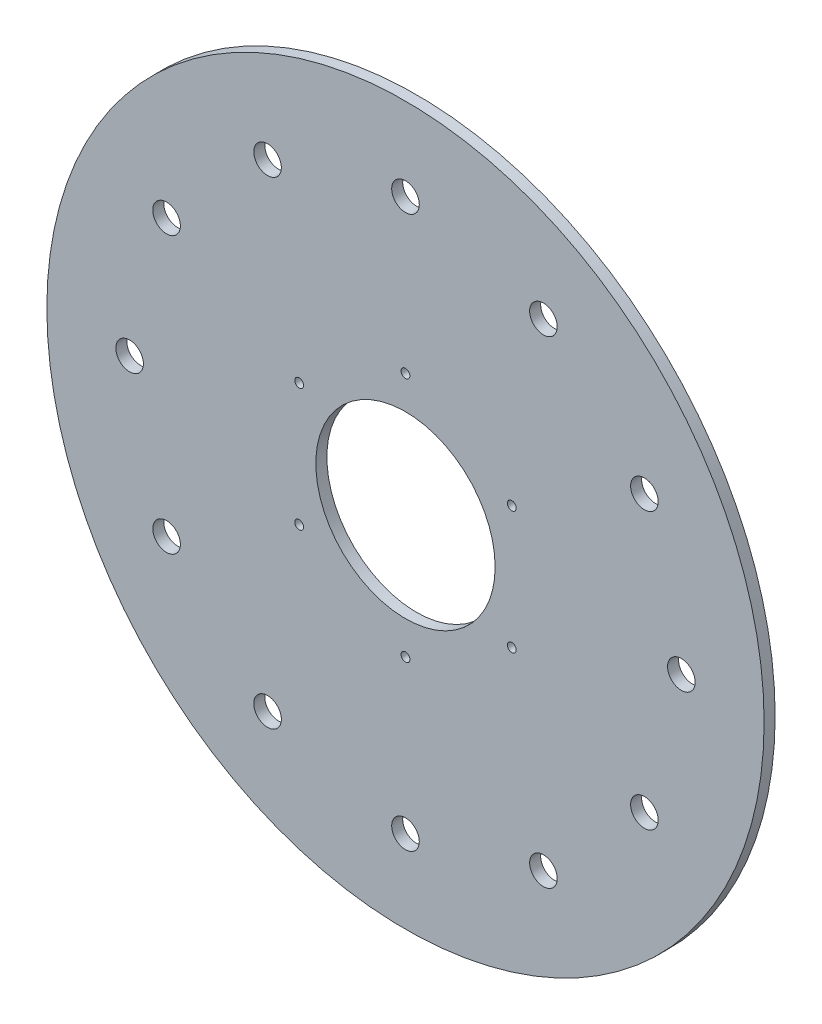
ISO-10303-21;
HEADER;
FILE_DESCRIPTION(('STEP AP214'),'2;1');
FILE_NAME('part.step','',(''),(''),'','','');
FILE_SCHEMA(('AUTOMOTIVE_DESIGN { 1 0 10303 214 1 1 1 1 }'));
ENDSEC;
DATA;
#1=APPLICATION_CONTEXT('core data for automotive mechanical design processes');
#2=APPLICATION_PROTOCOL_DEFINITION('international standard','automotive_design',2000,#1);
#3=PRODUCT_CONTEXT('',#1,'mechanical');
#4=PRODUCT('Part','Part','',(#3));
#5=PRODUCT_RELATED_PRODUCT_CATEGORY('part','',(#4));
#6=PRODUCT_DEFINITION_FORMATION('','',#4);
#7=PRODUCT_DEFINITION_CONTEXT('part definition',#1,'design');
#8=PRODUCT_DEFINITION('design','',#6,#7);
#9=PRODUCT_DEFINITION_SHAPE('','',#8);
#10=(LENGTH_UNIT() NAMED_UNIT(*) SI_UNIT(.MILLI.,.METRE.));
#11=(NAMED_UNIT(*) PLANE_ANGLE_UNIT() SI_UNIT($,.RADIAN.));
#12=(NAMED_UNIT(*) SI_UNIT($,.STERADIAN.) SOLID_ANGLE_UNIT());
#13=UNCERTAINTY_MEASURE_WITH_UNIT(LENGTH_MEASURE(1.E-05),#10,'distance_accuracy_value','');
#14=(GEOMETRIC_REPRESENTATION_CONTEXT(3) GLOBAL_UNCERTAINTY_ASSIGNED_CONTEXT((#13)) GLOBAL_UNIT_ASSIGNED_CONTEXT((#10,
#11,#12)) REPRESENTATION_CONTEXT('',''));
#15=CARTESIAN_POINT('',(0.,0.,0.));
#16=DIRECTION('',(0.,0.,1.));
#17=DIRECTION('',(1.,0.,0.));
#18=AXIS2_PLACEMENT_3D('',#15,#16,#17);
#19=CARTESIAN_POINT('',(0.,0.,4.));
#20=DIRECTION('',(0.,0.,1.));
#21=DIRECTION('',(1.,0.,0.));
#22=AXIS2_PLACEMENT_3D('',#19,#20,#21);
#23=PLANE('',#22);
#24=CARTESIAN_POINT('',(-38.5381304684077,-22.2499999999996,4.));
#25=DIRECTION('',(0.,0.,1.));
#26=DIRECTION('',(1.,0.,0.));
#27=AXIS2_PLACEMENT_3D('',#24,#25,#26);
#28=CIRCLE('',#27,1.60000000000001);
#29=CARTESIAN_POINT('',(-36.9381304684077,-22.2499999999996,4.));
#30=VERTEX_POINT('',#29);
#31=EDGE_CURVE('E149',#30,#30,#28,.T.);
#32=ORIENTED_EDGE('',*,*,#31,.F.);
#33=EDGE_LOOP('',(#32));
#34=FACE_BOUND('',#33,.T.);
#35=CARTESIAN_POINT('',(38.5381304684074,-22.2500000000002,4.));
#36=DIRECTION('',(0.,0.,1.));
#37=DIRECTION('',(1.,0.,0.));
#38=AXIS2_PLACEMENT_3D('',#35,#36,#37);
#39=CIRCLE('',#38,1.6);
#40=CARTESIAN_POINT('',(40.1381304684074,-22.2500000000002,4.));
#41=VERTEX_POINT('',#40);
#42=EDGE_CURVE('E137',#41,#41,#39,.T.);
#43=ORIENTED_EDGE('',*,*,#42,.F.);
#44=EDGE_LOOP('',(#43));
#45=FACE_BOUND('',#44,.T.);
#46=CARTESIAN_POINT('',(-49.9999999999989,86.6025403784445,4.));
#47=DIRECTION('',(0.,0.,1.));
#48=DIRECTION('',(1.,0.,0.));
#49=AXIS2_PLACEMENT_3D('',#46,#47,#48);
#50=CIRCLE('',#49,5.);
#51=CARTESIAN_POINT('',(-44.9999999999989,86.6025403784445,4.));
#52=VERTEX_POINT('',#51);
#53=EDGE_CURVE('E125',#52,#52,#50,.T.);
#54=ORIENTED_EDGE('',*,*,#53,.F.);
#55=EDGE_LOOP('',(#54));
#56=FACE_BOUND('',#55,.T.);
#57=CARTESIAN_POINT('',(-100.,1.04744440165294E-12,4.));
#58=DIRECTION('',(0.,0.,1.));
#59=DIRECTION('',(1.,0.,0.));
#60=AXIS2_PLACEMENT_3D('',#57,#58,#59);
#61=CIRCLE('',#60,5.);
#62=CARTESIAN_POINT('',(-95.,1.04744440165294E-12,4.));
#63=VERTEX_POINT('',#62);
#64=EDGE_CURVE('E113',#63,#63,#61,.T.);
#65=ORIENTED_EDGE('',*,*,#64,.F.);
#66=EDGE_LOOP('',(#65));
#67=FACE_BOUND('',#66,.T.);
#68=CARTESIAN_POINT('',(-50.0000000000007,-86.6025403784435,4.));
#69=DIRECTION('',(0.,0.,1.));
#70=DIRECTION('',(1.,0.,0.));
#71=AXIS2_PLACEMENT_3D('',#68,#69,#70);
#72=CIRCLE('',#71,5.00000000000001);
#73=CARTESIAN_POINT('',(-45.0000000000007,-86.6025403784435,4.));
#74=VERTEX_POINT('',#73);
#75=EDGE_CURVE('E101',#74,#74,#72,.T.);
#76=ORIENTED_EDGE('',*,*,#75,.F.);
#77=EDGE_LOOP('',(#76));
#78=FACE_BOUND('',#77,.T.);
#79=CARTESIAN_POINT('',(49.9999999999995,-86.6025403784442,4.));
#80=DIRECTION('',(0.,0.,1.));
#81=DIRECTION('',(1.,0.,0.));
#82=AXIS2_PLACEMENT_3D('',#79,#80,#81);
#83=CIRCLE('',#82,5.);
#84=CARTESIAN_POINT('',(54.9999999999995,-86.6025403784442,4.));
#85=VERTEX_POINT('',#84);
#86=EDGE_CURVE('E89',#85,#85,#83,.T.);
#87=ORIENTED_EDGE('',*,*,#86,.F.);
#88=EDGE_LOOP('',(#87));
#89=FACE_BOUND('',#88,.T.);
#90=CARTESIAN_POINT('',(100.,-3.49148133884313E-13,4.));
#91=DIRECTION('',(0.,0.,1.));
#92=DIRECTION('',(1.,0.,0.));
#93=AXIS2_PLACEMENT_3D('',#90,#91,#92);
#94=CIRCLE('',#93,5.);
#95=CARTESIAN_POINT('',(105.,-3.49148133884313E-13,4.));
#96=VERTEX_POINT('',#95);
#97=EDGE_CURVE('E77',#96,#96,#94,.T.);
#98=ORIENTED_EDGE('',*,*,#97,.F.);
#99=EDGE_LOOP('',(#98));
#100=FACE_BOUND('',#99,.T.);
#101=CARTESIAN_POINT('',(50.0000000000001,86.6025403784438,4.));
#102=DIRECTION('',(0.,0.,1.));
#103=DIRECTION('',(1.,0.,0.));
#104=AXIS2_PLACEMENT_3D('',#101,#102,#103);
#105=CIRCLE('',#104,5.00000000000001);
#106=CARTESIAN_POINT('',(55.0000000000001,86.6025403784438,4.));
#107=VERTEX_POINT('',#106);
#108=EDGE_CURVE('E65',#107,#107,#105,.T.);
#109=ORIENTED_EDGE('',*,*,#108,.F.);
#110=EDGE_LOOP('',(#109));
#111=FACE_BOUND('',#110,.T.);
#112=CARTESIAN_POINT('',(0.,100.,4.));
#113=DIRECTION('',(0.,0.,1.));
#114=DIRECTION('',(1.,0.,0.));
#115=AXIS2_PLACEMENT_3D('',#112,#113,#114);
#116=CIRCLE('',#115,5.);
#117=CARTESIAN_POINT('',(5.,100.,4.));
#118=VERTEX_POINT('',#117);
#119=EDGE_CURVE('E53',#118,#118,#116,.T.);
#120=ORIENTED_EDGE('',*,*,#119,.F.);
#121=EDGE_LOOP('',(#120));
#122=FACE_BOUND('',#121,.T.);
#123=CARTESIAN_POINT('',(0.,0.,4.));
#124=DIRECTION('',(0.,0.,1.));
#125=DIRECTION('',(1.,0.,0.));
#126=AXIS2_PLACEMENT_3D('',#123,#124,#125);
#127=CIRCLE('',#126,130.);
#128=CARTESIAN_POINT('',(130.,0.,4.));
#129=VERTEX_POINT('',#128);
#130=EDGE_CURVE('E10',#129,#129,#127,.T.);
#131=ORIENTED_EDGE('',*,*,#130,.T.);
#132=EDGE_LOOP('',(#131));
#133=FACE_BOUND('',#132,.T.);
#134=CARTESIAN_POINT('',(0.,0.,4.));
#135=DIRECTION('',(0.,0.,1.));
#136=DIRECTION('',(1.,0.,0.));
#137=AXIS2_PLACEMENT_3D('',#134,#135,#136);
#138=CIRCLE('',#137,32.5);
#139=CARTESIAN_POINT('',(32.5,0.,4.));
#140=VERTEX_POINT('',#139);
#141=EDGE_CURVE('E48',#140,#140,#138,.T.);
#142=ORIENTED_EDGE('',*,*,#141,.F.);
#143=EDGE_LOOP('',(#142));
#144=FACE_BOUND('',#143,.T.);
#145=CARTESIAN_POINT('',(0.,44.5,4.));
#146=DIRECTION('',(0.,0.,1.));
#147=DIRECTION('',(1.,0.,0.));
#148=AXIS2_PLACEMENT_3D('',#145,#146,#147);
#149=CIRCLE('',#148,1.6);
#150=CARTESIAN_POINT('',(1.6,44.5,4.));
#151=VERTEX_POINT('',#150);
#152=EDGE_CURVE('E59',#151,#151,#149,.T.);
#153=ORIENTED_EDGE('',*,*,#152,.F.);
#154=EDGE_LOOP('',(#153));
#155=FACE_BOUND('',#154,.T.);
#156=CARTESIAN_POINT('',(86.602540378444,49.9999999999998,4.));
#157=DIRECTION('',(0.,0.,1.));
#158=DIRECTION('',(1.,0.,0.));
#159=AXIS2_PLACEMENT_3D('',#156,#157,#158);
#160=CIRCLE('',#159,5.);
#161=CARTESIAN_POINT('',(91.602540378444,49.9999999999998,4.));
#162=VERTEX_POINT('',#161);
#163=EDGE_CURVE('E71',#162,#162,#160,.T.);
#164=ORIENTED_EDGE('',*,*,#163,.F.);
#165=EDGE_LOOP('',(#164));
#166=FACE_BOUND('',#165,.T.);
#167=CARTESIAN_POINT('',(86.6025403784437,-50.0000000000004,4.));
#168=DIRECTION('',(0.,0.,1.));
#169=DIRECTION('',(1.,0.,0.));
#170=AXIS2_PLACEMENT_3D('',#167,#168,#169);
#171=CIRCLE('',#170,5.);
#172=CARTESIAN_POINT('',(91.6025403784437,-50.0000000000004,4.));
#173=VERTEX_POINT('',#172);
#174=EDGE_CURVE('E83',#173,#173,#171,.T.);
#175=ORIENTED_EDGE('',*,*,#174,.F.);
#176=EDGE_LOOP('',(#175));
#177=FACE_BOUND('',#176,.T.);
#178=CARTESIAN_POINT('',(-6.98296267768627E-13,-100.,4.));
#179=DIRECTION('',(0.,0.,1.));
#180=DIRECTION('',(1.,0.,0.));
#181=AXIS2_PLACEMENT_3D('',#178,#179,#180);
#182=CIRCLE('',#181,5.00000000000001);
#183=CARTESIAN_POINT('',(4.99999999999931,-100.,4.));
#184=VERTEX_POINT('',#183);
#185=EDGE_CURVE('E95',#184,#184,#182,.T.);
#186=ORIENTED_EDGE('',*,*,#185,.F.);
#187=EDGE_LOOP('',(#186));
#188=FACE_BOUND('',#187,.T.);
#189=CARTESIAN_POINT('',(-86.6025403784444,-49.9999999999992,4.));
#190=DIRECTION('',(0.,0.,1.));
#191=DIRECTION('',(1.,0.,0.));
#192=AXIS2_PLACEMENT_3D('',#189,#190,#191);
#193=CIRCLE('',#192,5.);
#194=CARTESIAN_POINT('',(-81.6025403784444,-49.9999999999992,4.));
#195=VERTEX_POINT('',#194);
#196=EDGE_CURVE('E107',#195,#195,#193,.T.);
#197=ORIENTED_EDGE('',*,*,#196,.F.);
#198=EDGE_LOOP('',(#197));
#199=FACE_BOUND('',#198,.T.);
#200=CARTESIAN_POINT('',(-86.6025403784433,50.000000000001,4.));
#201=DIRECTION('',(0.,0.,1.));
#202=DIRECTION('',(1.,0.,0.));
#203=AXIS2_PLACEMENT_3D('',#200,#201,#202);
#204=CIRCLE('',#203,5.);
#205=CARTESIAN_POINT('',(-81.6025403784433,50.000000000001,4.));
#206=VERTEX_POINT('',#205);
#207=EDGE_CURVE('E119',#206,#206,#204,.T.);
#208=ORIENTED_EDGE('',*,*,#207,.F.);
#209=EDGE_LOOP('',(#208));
#210=FACE_BOUND('',#209,.T.);
#211=CARTESIAN_POINT('',(38.5381304684076,22.2499999999999,4.));
#212=DIRECTION('',(0.,0.,1.));
#213=DIRECTION('',(1.,0.,0.));
#214=AXIS2_PLACEMENT_3D('',#211,#212,#213);
#215=CIRCLE('',#214,1.60000000000001);
#216=CARTESIAN_POINT('',(40.1381304684076,22.2499999999999,4.));
#217=VERTEX_POINT('',#216);
#218=EDGE_CURVE('E131',#217,#217,#215,.T.);
#219=ORIENTED_EDGE('',*,*,#218,.F.);
#220=EDGE_LOOP('',(#219));
#221=FACE_BOUND('',#220,.T.);
#222=CARTESIAN_POINT('',(-3.10741839157039E-13,-44.5,4.));
#223=DIRECTION('',(0.,0.,1.));
#224=DIRECTION('',(1.,0.,0.));
#225=AXIS2_PLACEMENT_3D('',#222,#223,#224);
#226=CIRCLE('',#225,1.6);
#227=CARTESIAN_POINT('',(1.59999999999969,-44.5,4.));
#228=VERTEX_POINT('',#227);
#229=EDGE_CURVE('E143',#228,#228,#226,.T.);
#230=ORIENTED_EDGE('',*,*,#229,.F.);
#231=EDGE_LOOP('',(#230));
#232=FACE_BOUND('',#231,.T.);
#233=CARTESIAN_POINT('',(-38.5381304684073,22.2500000000004,4.));
#234=DIRECTION('',(0.,0.,1.));
#235=DIRECTION('',(1.,0.,0.));
#236=AXIS2_PLACEMENT_3D('',#233,#234,#235);
#237=CIRCLE('',#236,1.60000000000001);
#238=CARTESIAN_POINT('',(-36.9381304684073,22.2500000000004,4.));
#239=VERTEX_POINT('',#238);
#240=EDGE_CURVE('E155',#239,#239,#237,.T.);
#241=ORIENTED_EDGE('',*,*,#240,.F.);
#242=EDGE_LOOP('',(#241));
#243=FACE_BOUND('',#242,.T.);
#244=ADVANCED_FACE('F37',(#34,#45,#56,#67,#78,#89,#100,#111,#122,#133,#144,#155,#166,#177,#188,
#199,#210,#221,#232,#243),#23,.T.);
#245=CARTESIAN_POINT('',(0.,0.,0.));
#246=DIRECTION('',(0.,0.,1.));
#247=DIRECTION('',(1.,0.,0.));
#248=AXIS2_PLACEMENT_3D('',#245,#246,#247);
#249=PLANE('',#248);
#250=CARTESIAN_POINT('',(0.,0.,0.));
#251=DIRECTION('',(0.,0.,1.));
#252=DIRECTION('',(1.,0.,0.));
#253=AXIS2_PLACEMENT_3D('',#250,#251,#252);
#254=CIRCLE('',#253,130.);
#255=CARTESIAN_POINT('',(130.,0.,0.));
#256=VERTEX_POINT('',#255);
#257=EDGE_CURVE('E41',#256,#256,#254,.T.);
#258=ORIENTED_EDGE('',*,*,#257,.F.);
#259=EDGE_LOOP('',(#258));
#260=FACE_BOUND('',#259,.T.);
#261=CARTESIAN_POINT('',(0.,0.,0.));
#262=DIRECTION('',(0.,0.,1.));
#263=DIRECTION('',(1.,0.,0.));
#264=AXIS2_PLACEMENT_3D('',#261,#262,#263);
#265=CIRCLE('',#264,32.5);
#266=CARTESIAN_POINT('',(32.5,0.,0.));
#267=VERTEX_POINT('',#266);
#268=EDGE_CURVE('E50',#267,#267,#265,.T.);
#269=ORIENTED_EDGE('',*,*,#268,.T.);
#270=EDGE_LOOP('',(#269));
#271=FACE_BOUND('',#270,.T.);
#272=CARTESIAN_POINT('',(0.,100.,0.));
#273=DIRECTION('',(0.,0.,1.));
#274=DIRECTION('',(1.,0.,0.));
#275=AXIS2_PLACEMENT_3D('',#272,#273,#274);
#276=CIRCLE('',#275,5.);
#277=CARTESIAN_POINT('',(5.,100.,0.));
#278=VERTEX_POINT('',#277);
#279=EDGE_CURVE('E56',#278,#278,#276,.T.);
#280=ORIENTED_EDGE('',*,*,#279,.T.);
#281=EDGE_LOOP('',(#280));
#282=FACE_BOUND('',#281,.T.);
#283=CARTESIAN_POINT('',(0.,44.5,0.));
#284=DIRECTION('',(0.,0.,1.));
#285=DIRECTION('',(1.,0.,0.));
#286=AXIS2_PLACEMENT_3D('',#283,#284,#285);
#287=CIRCLE('',#286,1.6);
#288=CARTESIAN_POINT('',(1.6,44.5,0.));
#289=VERTEX_POINT('',#288);
#290=EDGE_CURVE('E62',#289,#289,#287,.T.);
#291=ORIENTED_EDGE('',*,*,#290,.T.);
#292=EDGE_LOOP('',(#291));
#293=FACE_BOUND('',#292,.T.);
#294=CARTESIAN_POINT('',(50.0000000000001,86.6025403784438,0.));
#295=DIRECTION('',(0.,0.,1.));
#296=DIRECTION('',(1.,0.,0.));
#297=AXIS2_PLACEMENT_3D('',#294,#295,#296);
#298=CIRCLE('',#297,5.00000000000001);
#299=CARTESIAN_POINT('',(55.0000000000001,86.6025403784438,0.));
#300=VERTEX_POINT('',#299);
#301=EDGE_CURVE('E68',#300,#300,#298,.T.);
#302=ORIENTED_EDGE('',*,*,#301,.T.);
#303=EDGE_LOOP('',(#302));
#304=FACE_BOUND('',#303,.T.);
#305=CARTESIAN_POINT('',(86.602540378444,49.9999999999998,0.));
#306=DIRECTION('',(0.,0.,1.));
#307=DIRECTION('',(1.,0.,0.));
#308=AXIS2_PLACEMENT_3D('',#305,#306,#307);
#309=CIRCLE('',#308,5.);
#310=CARTESIAN_POINT('',(91.602540378444,49.9999999999998,0.));
#311=VERTEX_POINT('',#310);
#312=EDGE_CURVE('E74',#311,#311,#309,.T.);
#313=ORIENTED_EDGE('',*,*,#312,.T.);
#314=EDGE_LOOP('',(#313));
#315=FACE_BOUND('',#314,.T.);
#316=CARTESIAN_POINT('',(100.,-3.49148133884313E-13,0.));
#317=DIRECTION('',(0.,0.,1.));
#318=DIRECTION('',(1.,0.,0.));
#319=AXIS2_PLACEMENT_3D('',#316,#317,#318);
#320=CIRCLE('',#319,5.);
#321=CARTESIAN_POINT('',(105.,-3.49148133884313E-13,0.));
#322=VERTEX_POINT('',#321);
#323=EDGE_CURVE('E80',#322,#322,#320,.T.);
#324=ORIENTED_EDGE('',*,*,#323,.T.);
#325=EDGE_LOOP('',(#324));
#326=FACE_BOUND('',#325,.T.);
#327=CARTESIAN_POINT('',(86.6025403784437,-50.0000000000004,0.));
#328=DIRECTION('',(0.,0.,1.));
#329=DIRECTION('',(1.,0.,0.));
#330=AXIS2_PLACEMENT_3D('',#327,#328,#329);
#331=CIRCLE('',#330,5.);
#332=CARTESIAN_POINT('',(91.6025403784437,-50.0000000000004,0.));
#333=VERTEX_POINT('',#332);
#334=EDGE_CURVE('E86',#333,#333,#331,.T.);
#335=ORIENTED_EDGE('',*,*,#334,.T.);
#336=EDGE_LOOP('',(#335));
#337=FACE_BOUND('',#336,.T.);
#338=CARTESIAN_POINT('',(49.9999999999995,-86.6025403784442,0.));
#339=DIRECTION('',(0.,0.,1.));
#340=DIRECTION('',(1.,0.,0.));
#341=AXIS2_PLACEMENT_3D('',#338,#339,#340);
#342=CIRCLE('',#341,5.);
#343=CARTESIAN_POINT('',(54.9999999999995,-86.6025403784442,0.));
#344=VERTEX_POINT('',#343);
#345=EDGE_CURVE('E92',#344,#344,#342,.T.);
#346=ORIENTED_EDGE('',*,*,#345,.T.);
#347=EDGE_LOOP('',(#346));
#348=FACE_BOUND('',#347,.T.);
#349=CARTESIAN_POINT('',(-6.98296267768627E-13,-100.,0.));
#350=DIRECTION('',(0.,0.,1.));
#351=DIRECTION('',(1.,0.,0.));
#352=AXIS2_PLACEMENT_3D('',#349,#350,#351);
#353=CIRCLE('',#352,5.00000000000001);
#354=CARTESIAN_POINT('',(4.99999999999931,-100.,0.));
#355=VERTEX_POINT('',#354);
#356=EDGE_CURVE('E98',#355,#355,#353,.T.);
#357=ORIENTED_EDGE('',*,*,#356,.T.);
#358=EDGE_LOOP('',(#357));
#359=FACE_BOUND('',#358,.T.);
#360=CARTESIAN_POINT('',(-50.0000000000007,-86.6025403784435,0.));
#361=DIRECTION('',(0.,0.,1.));
#362=DIRECTION('',(1.,0.,0.));
#363=AXIS2_PLACEMENT_3D('',#360,#361,#362);
#364=CIRCLE('',#363,5.00000000000001);
#365=CARTESIAN_POINT('',(-45.0000000000007,-86.6025403784435,0.));
#366=VERTEX_POINT('',#365);
#367=EDGE_CURVE('E104',#366,#366,#364,.T.);
#368=ORIENTED_EDGE('',*,*,#367,.T.);
#369=EDGE_LOOP('',(#368));
#370=FACE_BOUND('',#369,.T.);
#371=CARTESIAN_POINT('',(-86.6025403784444,-49.9999999999992,0.));
#372=DIRECTION('',(0.,0.,1.));
#373=DIRECTION('',(1.,0.,0.));
#374=AXIS2_PLACEMENT_3D('',#371,#372,#373);
#375=CIRCLE('',#374,5.);
#376=CARTESIAN_POINT('',(-81.6025403784444,-49.9999999999992,0.));
#377=VERTEX_POINT('',#376);
#378=EDGE_CURVE('E110',#377,#377,#375,.T.);
#379=ORIENTED_EDGE('',*,*,#378,.T.);
#380=EDGE_LOOP('',(#379));
#381=FACE_BOUND('',#380,.T.);
#382=CARTESIAN_POINT('',(-100.,1.04744440165294E-12,0.));
#383=DIRECTION('',(0.,0.,1.));
#384=DIRECTION('',(1.,0.,0.));
#385=AXIS2_PLACEMENT_3D('',#382,#383,#384);
#386=CIRCLE('',#385,5.);
#387=CARTESIAN_POINT('',(-95.,1.04744440165294E-12,0.));
#388=VERTEX_POINT('',#387);
#389=EDGE_CURVE('E116',#388,#388,#386,.T.);
#390=ORIENTED_EDGE('',*,*,#389,.T.);
#391=EDGE_LOOP('',(#390));
#392=FACE_BOUND('',#391,.T.);
#393=CARTESIAN_POINT('',(-86.6025403784433,50.000000000001,0.));
#394=DIRECTION('',(0.,0.,1.));
#395=DIRECTION('',(1.,0.,0.));
#396=AXIS2_PLACEMENT_3D('',#393,#394,#395);
#397=CIRCLE('',#396,5.);
#398=CARTESIAN_POINT('',(-81.6025403784433,50.000000000001,0.));
#399=VERTEX_POINT('',#398);
#400=EDGE_CURVE('E122',#399,#399,#397,.T.);
#401=ORIENTED_EDGE('',*,*,#400,.T.);
#402=EDGE_LOOP('',(#401));
#403=FACE_BOUND('',#402,.T.);
#404=CARTESIAN_POINT('',(-49.9999999999989,86.6025403784445,0.));
#405=DIRECTION('',(0.,0.,1.));
#406=DIRECTION('',(1.,0.,0.));
#407=AXIS2_PLACEMENT_3D('',#404,#405,#406);
#408=CIRCLE('',#407,5.);
#409=CARTESIAN_POINT('',(-44.9999999999989,86.6025403784445,0.));
#410=VERTEX_POINT('',#409);
#411=EDGE_CURVE('E128',#410,#410,#408,.T.);
#412=ORIENTED_EDGE('',*,*,#411,.T.);
#413=EDGE_LOOP('',(#412));
#414=FACE_BOUND('',#413,.T.);
#415=CARTESIAN_POINT('',(38.5381304684076,22.2499999999999,0.));
#416=DIRECTION('',(0.,0.,1.));
#417=DIRECTION('',(1.,0.,0.));
#418=AXIS2_PLACEMENT_3D('',#415,#416,#417);
#419=CIRCLE('',#418,1.60000000000001);
#420=CARTESIAN_POINT('',(40.1381304684076,22.2499999999999,0.));
#421=VERTEX_POINT('',#420);
#422=EDGE_CURVE('E134',#421,#421,#419,.T.);
#423=ORIENTED_EDGE('',*,*,#422,.T.);
#424=EDGE_LOOP('',(#423));
#425=FACE_BOUND('',#424,.T.);
#426=CARTESIAN_POINT('',(38.5381304684074,-22.2500000000002,0.));
#427=DIRECTION('',(0.,0.,1.));
#428=DIRECTION('',(1.,0.,0.));
#429=AXIS2_PLACEMENT_3D('',#426,#427,#428);
#430=CIRCLE('',#429,1.6);
#431=CARTESIAN_POINT('',(40.1381304684074,-22.2500000000002,0.));
#432=VERTEX_POINT('',#431);
#433=EDGE_CURVE('E140',#432,#432,#430,.T.);
#434=ORIENTED_EDGE('',*,*,#433,.T.);
#435=EDGE_LOOP('',(#434));
#436=FACE_BOUND('',#435,.T.);
#437=CARTESIAN_POINT('',(-3.10741839157039E-13,-44.5,0.));
#438=DIRECTION('',(0.,0.,1.));
#439=DIRECTION('',(1.,0.,0.));
#440=AXIS2_PLACEMENT_3D('',#437,#438,#439);
#441=CIRCLE('',#440,1.6);
#442=CARTESIAN_POINT('',(1.59999999999969,-44.5,0.));
#443=VERTEX_POINT('',#442);
#444=EDGE_CURVE('E146',#443,#443,#441,.T.);
#445=ORIENTED_EDGE('',*,*,#444,.T.);
#446=EDGE_LOOP('',(#445));
#447=FACE_BOUND('',#446,.T.);
#448=CARTESIAN_POINT('',(-38.5381304684077,-22.2499999999996,0.));
#449=DIRECTION('',(0.,0.,1.));
#450=DIRECTION('',(1.,0.,0.));
#451=AXIS2_PLACEMENT_3D('',#448,#449,#450);
#452=CIRCLE('',#451,1.60000000000001);
#453=CARTESIAN_POINT('',(-36.9381304684077,-22.2499999999996,0.));
#454=VERTEX_POINT('',#453);
#455=EDGE_CURVE('E152',#454,#454,#452,.T.);
#456=ORIENTED_EDGE('',*,*,#455,.T.);
#457=EDGE_LOOP('',(#456));
#458=FACE_BOUND('',#457,.T.);
#459=CARTESIAN_POINT('',(-38.5381304684073,22.2500000000004,0.));
#460=DIRECTION('',(0.,0.,1.));
#461=DIRECTION('',(1.,0.,0.));
#462=AXIS2_PLACEMENT_3D('',#459,#460,#461);
#463=CIRCLE('',#462,1.60000000000001);
#464=CARTESIAN_POINT('',(-36.9381304684073,22.2500000000004,0.));
#465=VERTEX_POINT('',#464);
#466=EDGE_CURVE('E158',#465,#465,#463,.T.);
#467=ORIENTED_EDGE('',*,*,#466,.T.);
#468=EDGE_LOOP('',(#467));
#469=FACE_BOUND('',#468,.T.);
#470=ADVANCED_FACE('F168',(#260,#271,#282,#293,#304,#315,#326,#337,#348,#359,#370,#381,#392,
#403,#414,#425,#436,#447,#458,#469),#249,.F.);
#471=CARTESIAN_POINT('',(0.,0.,4.));
#472=DIRECTION('',(0.,0.,-1.));
#473=DIRECTION('',(-1.,0.,0.));
#474=AXIS2_PLACEMENT_3D('',#471,#472,#473);
#475=CYLINDRICAL_SURFACE('',#474,130.);
#476=ORIENTED_EDGE('',*,*,#130,.F.);
#477=EDGE_LOOP('',(#476));
#478=FACE_BOUND('',#477,.T.);
#479=ORIENTED_EDGE('',*,*,#257,.T.);
#480=EDGE_LOOP('',(#479));
#481=FACE_BOUND('',#480,.T.);
#482=ADVANCED_FACE('F39',(#478,#481),#475,.T.);
#483=CARTESIAN_POINT('',(0.,0.,4.));
#484=DIRECTION('',(0.,0.,-1.));
#485=DIRECTION('',(-1.,0.,0.));
#486=AXIS2_PLACEMENT_3D('',#483,#484,#485);
#487=CYLINDRICAL_SURFACE('',#486,32.5);
#488=ORIENTED_EDGE('',*,*,#141,.T.);
#489=EDGE_LOOP('',(#488));
#490=FACE_BOUND('',#489,.T.);
#491=ORIENTED_EDGE('',*,*,#268,.F.);
#492=EDGE_LOOP('',(#491));
#493=FACE_BOUND('',#492,.T.);
#494=ADVANCED_FACE('F178',(#490,#493),#487,.F.);
#495=CARTESIAN_POINT('',(0.,100.,4.));
#496=DIRECTION('',(0.,0.,-1.));
#497=DIRECTION('',(-1.,0.,0.));
#498=AXIS2_PLACEMENT_3D('',#495,#496,#497);
#499=CYLINDRICAL_SURFACE('',#498,5.);
#500=ORIENTED_EDGE('',*,*,#119,.T.);
#501=EDGE_LOOP('',(#500));
#502=FACE_BOUND('',#501,.T.);
#503=ORIENTED_EDGE('',*,*,#279,.F.);
#504=EDGE_LOOP('',(#503));
#505=FACE_BOUND('',#504,.T.);
#506=ADVANCED_FACE('F181',(#502,#505),#499,.F.);
#507=CARTESIAN_POINT('',(0.,44.5,4.));
#508=DIRECTION('',(0.,0.,-1.));
#509=DIRECTION('',(-1.,0.,0.));
#510=AXIS2_PLACEMENT_3D('',#507,#508,#509);
#511=CYLINDRICAL_SURFACE('',#510,1.6);
#512=ORIENTED_EDGE('',*,*,#152,.T.);
#513=EDGE_LOOP('',(#512));
#514=FACE_BOUND('',#513,.T.);
#515=ORIENTED_EDGE('',*,*,#290,.F.);
#516=EDGE_LOOP('',(#515));
#517=FACE_BOUND('',#516,.T.);
#518=ADVANCED_FACE('F185',(#514,#517),#511,.F.);
#519=CARTESIAN_POINT('',(50.0000000000001,86.6025403784438,4.));
#520=DIRECTION('',(0.,0.,-1.));
#521=DIRECTION('',(-1.,0.,0.));
#522=AXIS2_PLACEMENT_3D('',#519,#520,#521);
#523=CYLINDRICAL_SURFACE('',#522,5.00000000000001);
#524=ORIENTED_EDGE('',*,*,#108,.T.);
#525=EDGE_LOOP('',(#524));
#526=FACE_BOUND('',#525,.T.);
#527=ORIENTED_EDGE('',*,*,#301,.F.);
#528=EDGE_LOOP('',(#527));
#529=FACE_BOUND('',#528,.T.);
#530=ADVANCED_FACE('F189',(#526,#529),#523,.F.);
#531=CARTESIAN_POINT('',(86.602540378444,49.9999999999998,4.));
#532=DIRECTION('',(0.,0.,-1.));
#533=DIRECTION('',(-1.,0.,0.));
#534=AXIS2_PLACEMENT_3D('',#531,#532,#533);
#535=CYLINDRICAL_SURFACE('',#534,5.);
#536=ORIENTED_EDGE('',*,*,#163,.T.);
#537=EDGE_LOOP('',(#536));
#538=FACE_BOUND('',#537,.T.);
#539=ORIENTED_EDGE('',*,*,#312,.F.);
#540=EDGE_LOOP('',(#539));
#541=FACE_BOUND('',#540,.T.);
#542=ADVANCED_FACE('F193',(#538,#541),#535,.F.);
#543=CARTESIAN_POINT('',(100.,-3.49148133884313E-13,4.));
#544=DIRECTION('',(0.,0.,-1.));
#545=DIRECTION('',(-1.,0.,0.));
#546=AXIS2_PLACEMENT_3D('',#543,#544,#545);
#547=CYLINDRICAL_SURFACE('',#546,5.);
#548=ORIENTED_EDGE('',*,*,#97,.T.);
#549=EDGE_LOOP('',(#548));
#550=FACE_BOUND('',#549,.T.);
#551=ORIENTED_EDGE('',*,*,#323,.F.);
#552=EDGE_LOOP('',(#551));
#553=FACE_BOUND('',#552,.T.);
#554=ADVANCED_FACE('F197',(#550,#553),#547,.F.);
#555=CARTESIAN_POINT('',(86.6025403784437,-50.0000000000004,4.));
#556=DIRECTION('',(0.,0.,-1.));
#557=DIRECTION('',(-1.,0.,0.));
#558=AXIS2_PLACEMENT_3D('',#555,#556,#557);
#559=CYLINDRICAL_SURFACE('',#558,5.);
#560=ORIENTED_EDGE('',*,*,#174,.T.);
#561=EDGE_LOOP('',(#560));
#562=FACE_BOUND('',#561,.T.);
#563=ORIENTED_EDGE('',*,*,#334,.F.);
#564=EDGE_LOOP('',(#563));
#565=FACE_BOUND('',#564,.T.);
#566=ADVANCED_FACE('F201',(#562,#565),#559,.F.);
#567=CARTESIAN_POINT('',(49.9999999999995,-86.6025403784442,4.));
#568=DIRECTION('',(0.,0.,-1.));
#569=DIRECTION('',(-1.,0.,0.));
#570=AXIS2_PLACEMENT_3D('',#567,#568,#569);
#571=CYLINDRICAL_SURFACE('',#570,5.);
#572=ORIENTED_EDGE('',*,*,#86,.T.);
#573=EDGE_LOOP('',(#572));
#574=FACE_BOUND('',#573,.T.);
#575=ORIENTED_EDGE('',*,*,#345,.F.);
#576=EDGE_LOOP('',(#575));
#577=FACE_BOUND('',#576,.T.);
#578=ADVANCED_FACE('F205',(#574,#577),#571,.F.);
#579=CARTESIAN_POINT('',(-6.98296267768627E-13,-100.,4.));
#580=DIRECTION('',(0.,0.,-1.));
#581=DIRECTION('',(-1.,0.,0.));
#582=AXIS2_PLACEMENT_3D('',#579,#580,#581);
#583=CYLINDRICAL_SURFACE('',#582,5.00000000000001);
#584=ORIENTED_EDGE('',*,*,#185,.T.);
#585=EDGE_LOOP('',(#584));
#586=FACE_BOUND('',#585,.T.);
#587=ORIENTED_EDGE('',*,*,#356,.F.);
#588=EDGE_LOOP('',(#587));
#589=FACE_BOUND('',#588,.T.);
#590=ADVANCED_FACE('F209',(#586,#589),#583,.F.);
#591=CARTESIAN_POINT('',(-50.0000000000007,-86.6025403784435,4.));
#592=DIRECTION('',(0.,0.,-1.));
#593=DIRECTION('',(-1.,0.,0.));
#594=AXIS2_PLACEMENT_3D('',#591,#592,#593);
#595=CYLINDRICAL_SURFACE('',#594,5.00000000000001);
#596=ORIENTED_EDGE('',*,*,#75,.T.);
#597=EDGE_LOOP('',(#596));
#598=FACE_BOUND('',#597,.T.);
#599=ORIENTED_EDGE('',*,*,#367,.F.);
#600=EDGE_LOOP('',(#599));
#601=FACE_BOUND('',#600,.T.);
#602=ADVANCED_FACE('F213',(#598,#601),#595,.F.);
#603=CARTESIAN_POINT('',(-86.6025403784444,-49.9999999999992,4.));
#604=DIRECTION('',(0.,0.,-1.));
#605=DIRECTION('',(-1.,0.,0.));
#606=AXIS2_PLACEMENT_3D('',#603,#604,#605);
#607=CYLINDRICAL_SURFACE('',#606,5.);
#608=ORIENTED_EDGE('',*,*,#196,.T.);
#609=EDGE_LOOP('',(#608));
#610=FACE_BOUND('',#609,.T.);
#611=ORIENTED_EDGE('',*,*,#378,.F.);
#612=EDGE_LOOP('',(#611));
#613=FACE_BOUND('',#612,.T.);
#614=ADVANCED_FACE('F217',(#610,#613),#607,.F.);
#615=CARTESIAN_POINT('',(-100.,1.04744440165294E-12,4.));
#616=DIRECTION('',(0.,0.,-1.));
#617=DIRECTION('',(-1.,0.,0.));
#618=AXIS2_PLACEMENT_3D('',#615,#616,#617);
#619=CYLINDRICAL_SURFACE('',#618,5.);
#620=ORIENTED_EDGE('',*,*,#64,.T.);
#621=EDGE_LOOP('',(#620));
#622=FACE_BOUND('',#621,.T.);
#623=ORIENTED_EDGE('',*,*,#389,.F.);
#624=EDGE_LOOP('',(#623));
#625=FACE_BOUND('',#624,.T.);
#626=ADVANCED_FACE('F221',(#622,#625),#619,.F.);
#627=CARTESIAN_POINT('',(-86.6025403784433,50.000000000001,4.));
#628=DIRECTION('',(0.,0.,-1.));
#629=DIRECTION('',(-1.,0.,0.));
#630=AXIS2_PLACEMENT_3D('',#627,#628,#629);
#631=CYLINDRICAL_SURFACE('',#630,5.);
#632=ORIENTED_EDGE('',*,*,#207,.T.);
#633=EDGE_LOOP('',(#632));
#634=FACE_BOUND('',#633,.T.);
#635=ORIENTED_EDGE('',*,*,#400,.F.);
#636=EDGE_LOOP('',(#635));
#637=FACE_BOUND('',#636,.T.);
#638=ADVANCED_FACE('F225',(#634,#637),#631,.F.);
#639=CARTESIAN_POINT('',(-49.9999999999989,86.6025403784445,4.));
#640=DIRECTION('',(0.,0.,-1.));
#641=DIRECTION('',(-1.,0.,0.));
#642=AXIS2_PLACEMENT_3D('',#639,#640,#641);
#643=CYLINDRICAL_SURFACE('',#642,5.);
#644=ORIENTED_EDGE('',*,*,#53,.T.);
#645=EDGE_LOOP('',(#644));
#646=FACE_BOUND('',#645,.T.);
#647=ORIENTED_EDGE('',*,*,#411,.F.);
#648=EDGE_LOOP('',(#647));
#649=FACE_BOUND('',#648,.T.);
#650=ADVANCED_FACE('F229',(#646,#649),#643,.F.);
#651=CARTESIAN_POINT('',(38.5381304684076,22.2499999999999,4.));
#652=DIRECTION('',(0.,0.,-1.));
#653=DIRECTION('',(-1.,0.,0.));
#654=AXIS2_PLACEMENT_3D('',#651,#652,#653);
#655=CYLINDRICAL_SURFACE('',#654,1.60000000000001);
#656=ORIENTED_EDGE('',*,*,#218,.T.);
#657=EDGE_LOOP('',(#656));
#658=FACE_BOUND('',#657,.T.);
#659=ORIENTED_EDGE('',*,*,#422,.F.);
#660=EDGE_LOOP('',(#659));
#661=FACE_BOUND('',#660,.T.);
#662=ADVANCED_FACE('F233',(#658,#661),#655,.F.);
#663=CARTESIAN_POINT('',(38.5381304684074,-22.2500000000002,4.));
#664=DIRECTION('',(0.,0.,-1.));
#665=DIRECTION('',(-1.,0.,0.));
#666=AXIS2_PLACEMENT_3D('',#663,#664,#665);
#667=CYLINDRICAL_SURFACE('',#666,1.6);
#668=ORIENTED_EDGE('',*,*,#42,.T.);
#669=EDGE_LOOP('',(#668));
#670=FACE_BOUND('',#669,.T.);
#671=ORIENTED_EDGE('',*,*,#433,.F.);
#672=EDGE_LOOP('',(#671));
#673=FACE_BOUND('',#672,.T.);
#674=ADVANCED_FACE('F237',(#670,#673),#667,.F.);
#675=CARTESIAN_POINT('',(-3.10741839157039E-13,-44.5,4.));
#676=DIRECTION('',(0.,0.,-1.));
#677=DIRECTION('',(-1.,0.,0.));
#678=AXIS2_PLACEMENT_3D('',#675,#676,#677);
#679=CYLINDRICAL_SURFACE('',#678,1.6);
#680=ORIENTED_EDGE('',*,*,#229,.T.);
#681=EDGE_LOOP('',(#680));
#682=FACE_BOUND('',#681,.T.);
#683=ORIENTED_EDGE('',*,*,#444,.F.);
#684=EDGE_LOOP('',(#683));
#685=FACE_BOUND('',#684,.T.);
#686=ADVANCED_FACE('F241',(#682,#685),#679,.F.);
#687=CARTESIAN_POINT('',(-38.5381304684077,-22.2499999999996,4.));
#688=DIRECTION('',(0.,0.,-1.));
#689=DIRECTION('',(-1.,0.,0.));
#690=AXIS2_PLACEMENT_3D('',#687,#688,#689);
#691=CYLINDRICAL_SURFACE('',#690,1.60000000000001);
#692=ORIENTED_EDGE('',*,*,#31,.T.);
#693=EDGE_LOOP('',(#692));
#694=FACE_BOUND('',#693,.T.);
#695=ORIENTED_EDGE('',*,*,#455,.F.);
#696=EDGE_LOOP('',(#695));
#697=FACE_BOUND('',#696,.T.);
#698=ADVANCED_FACE('F245',(#694,#697),#691,.F.);
#699=CARTESIAN_POINT('',(-38.5381304684073,22.2500000000004,4.));
#700=DIRECTION('',(0.,0.,-1.));
#701=DIRECTION('',(-1.,0.,0.));
#702=AXIS2_PLACEMENT_3D('',#699,#700,#701);
#703=CYLINDRICAL_SURFACE('',#702,1.60000000000001);
#704=ORIENTED_EDGE('',*,*,#240,.T.);
#705=EDGE_LOOP('',(#704));
#706=FACE_BOUND('',#705,.T.);
#707=ORIENTED_EDGE('',*,*,#466,.F.);
#708=EDGE_LOOP('',(#707));
#709=FACE_BOUND('',#708,.T.);
#710=ADVANCED_FACE('F164',(#706,#709),#703,.F.);
#711=CLOSED_SHELL('',(#244,#470,#482,#494,#506,#518,#530,#542,#554,#566,#578,#590,#602,#614,
#626,#638,#650,#662,#674,#686,#698,#710));
#712=MANIFOLD_SOLID_BREP('B2',#711);
#713=ADVANCED_BREP_SHAPE_REPRESENTATION('',(#18,#712),#14);
#714=SHAPE_DEFINITION_REPRESENTATION(#9,#713);
ENDSEC;
END-ISO-10303-21;
